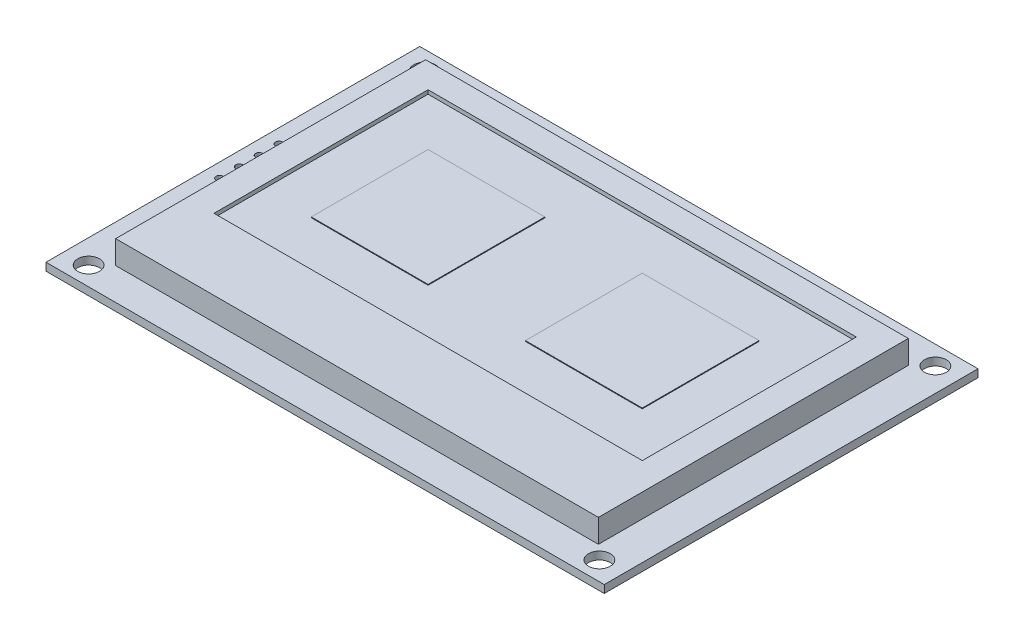
ISO-10303-21;
HEADER;
FILE_DESCRIPTION(('STEP AP214'),'2;1');
FILE_NAME('part.step','',(''),(''),'','','');
FILE_SCHEMA(('AUTOMOTIVE_DESIGN { 1 0 10303 214 1 1 1 1 }'));
ENDSEC;
DATA;
#1=APPLICATION_CONTEXT('core data for automotive mechanical design processes');
#2=APPLICATION_PROTOCOL_DEFINITION('international standard','automotive_design',2000,#1);
#3=PRODUCT_CONTEXT('',#1,'mechanical');
#4=PRODUCT('Part','Part','',(#3));
#5=PRODUCT_RELATED_PRODUCT_CATEGORY('part','',(#4));
#6=PRODUCT_DEFINITION_FORMATION('','',#4);
#7=PRODUCT_DEFINITION_CONTEXT('part definition',#1,'design');
#8=PRODUCT_DEFINITION('design','',#6,#7);
#9=PRODUCT_DEFINITION_SHAPE('','',#8);
#10=(LENGTH_UNIT() NAMED_UNIT(*) SI_UNIT(.MILLI.,.METRE.));
#11=(NAMED_UNIT(*) PLANE_ANGLE_UNIT() SI_UNIT($,.RADIAN.));
#12=(NAMED_UNIT(*) SI_UNIT($,.STERADIAN.) SOLID_ANGLE_UNIT());
#13=UNCERTAINTY_MEASURE_WITH_UNIT(LENGTH_MEASURE(1.E-05),#10,'distance_accuracy_value','');
#14=(GEOMETRIC_REPRESENTATION_CONTEXT(3) GLOBAL_UNCERTAINTY_ASSIGNED_CONTEXT((#13)) GLOBAL_UNIT_ASSIGNED_CONTEXT((#10,
#11,#12)) REPRESENTATION_CONTEXT('',''));
#15=CARTESIAN_POINT('',(0.,0.,0.));
#16=DIRECTION('',(0.,0.,1.));
#17=DIRECTION('',(1.,0.,0.));
#18=AXIS2_PLACEMENT_3D('',#15,#16,#17);
#19=CARTESIAN_POINT('',(0.,3.5,0.));
#20=DIRECTION('',(0.,1.,0.));
#21=DIRECTION('',(0.,0.,1.));
#22=AXIS2_PLACEMENT_3D('',#19,#20,#21);
#23=PLANE('',#22);
#24=DIRECTION('',(0.,0.,1.));
#25=VECTOR('',#24,1.);
#26=CARTESIAN_POINT('',(21.2525,3.5,4.52400000000001));
#27=LINE('',#26,#25);
#28=CARTESIAN_POINT('',(21.2525,3.5,-10.476));
#29=VERTEX_POINT('',#28);
#30=CARTESIAN_POINT('',(21.2525,3.5,4.52400000000001));
#31=VERTEX_POINT('',#30);
#32=EDGE_CURVE('E185',#29,#31,#27,.T.);
#33=ORIENTED_EDGE('',*,*,#32,.T.);
#34=DIRECTION('',(-1.,0.,0.));
#35=VECTOR('',#34,1.);
#36=CARTESIAN_POINT('',(6.2525,3.5,4.524));
#37=LINE('',#36,#35);
#38=CARTESIAN_POINT('',(6.2525,3.5,4.524));
#39=VERTEX_POINT('',#38);
#40=EDGE_CURVE('E199',#31,#39,#37,.T.);
#41=ORIENTED_EDGE('',*,*,#40,.T.);
#42=DIRECTION('',(0.,0.,-1.));
#43=VECTOR('',#42,1.);
#44=CARTESIAN_POINT('',(6.2525,3.5,4.524));
#45=LINE('',#44,#43);
#46=CARTESIAN_POINT('',(6.2525,3.5,-10.476));
#47=VERTEX_POINT('',#46);
#48=EDGE_CURVE('E63',#39,#47,#45,.T.);
#49=ORIENTED_EDGE('',*,*,#48,.T.);
#50=DIRECTION('',(1.,0.,0.));
#51=VECTOR('',#50,1.);
#52=CARTESIAN_POINT('',(6.2525,3.5,-10.476));
#53=LINE('',#52,#51);
#54=EDGE_CURVE('E58',#47,#29,#53,.T.);
#55=ORIENTED_EDGE('',*,*,#54,.T.);
#56=EDGE_LOOP('',(#33,#41,#49,#55));
#57=FACE_BOUND('',#56,.T.);
#58=DIRECTION('',(0.,0.,-1.));
#59=VECTOR('',#58,1.);
#60=CARTESIAN_POINT('',(27.505,3.5,-16.721));
#61=LINE('',#60,#59);
#62=CARTESIAN_POINT('',(27.505,3.5,10.769));
#63=VERTEX_POINT('',#62);
#64=CARTESIAN_POINT('',(27.505,3.5,-16.721));
#65=VERTEX_POINT('',#64);
#66=EDGE_CURVE('E294',#63,#65,#61,.T.);
#67=ORIENTED_EDGE('',*,*,#66,.T.);
#68=DIRECTION('',(-1.,0.,0.));
#69=VECTOR('',#68,1.);
#70=CARTESIAN_POINT('',(-27.505,3.5,-16.721));
#71=LINE('',#70,#69);
#72=CARTESIAN_POINT('',(-27.505,3.5,-16.721));
#73=VERTEX_POINT('',#72);
#74=EDGE_CURVE('E297',#65,#73,#71,.T.);
#75=ORIENTED_EDGE('',*,*,#74,.T.);
#76=DIRECTION('',(0.,0.,1.));
#77=VECTOR('',#76,1.);
#78=CARTESIAN_POINT('',(-27.505,3.5,-16.721));
#79=LINE('',#78,#77);
#80=CARTESIAN_POINT('',(-27.505,3.5,10.769));
#81=VERTEX_POINT('',#80);
#82=EDGE_CURVE('E301',#73,#81,#79,.T.);
#83=ORIENTED_EDGE('',*,*,#82,.T.);
#84=DIRECTION('',(1.,0.,0.));
#85=VECTOR('',#84,1.);
#86=CARTESIAN_POINT('',(-27.505,3.5,10.769));
#87=LINE('',#86,#85);
#88=EDGE_CURVE('E304',#81,#63,#87,.T.);
#89=ORIENTED_EDGE('',*,*,#88,.T.);
#90=EDGE_LOOP('',(#67,#75,#83,#89));
#91=FACE_BOUND('',#90,.T.);
#92=DIRECTION('',(1.,0.,0.));
#93=VECTOR('',#92,1.);
#94=CARTESIAN_POINT('',(-6.2525,3.5,4.524));
#95=LINE('',#94,#93);
#96=CARTESIAN_POINT('',(-21.2525,3.5,4.52400000000001));
#97=VERTEX_POINT('',#96);
#98=CARTESIAN_POINT('',(-6.2525,3.5,4.524));
#99=VERTEX_POINT('',#98);
#100=EDGE_CURVE('E230',#97,#99,#95,.T.);
#101=ORIENTED_EDGE('',*,*,#100,.F.);
#102=DIRECTION('',(0.,0.,1.));
#103=VECTOR('',#102,1.);
#104=CARTESIAN_POINT('',(-21.2525,3.5,4.52400000000001));
#105=LINE('',#104,#103);
#106=CARTESIAN_POINT('',(-21.2525,3.5,-10.476));
#107=VERTEX_POINT('',#106);
#108=EDGE_CURVE('E188',#107,#97,#105,.T.);
#109=ORIENTED_EDGE('',*,*,#108,.F.);
#110=DIRECTION('',(-1.,0.,0.));
#111=VECTOR('',#110,1.);
#112=CARTESIAN_POINT('',(-6.2525,3.5,-10.476));
#113=LINE('',#112,#111);
#114=CARTESIAN_POINT('',(-6.2525,3.5,-10.476));
#115=VERTEX_POINT('',#114);
#116=EDGE_CURVE('E221',#115,#107,#113,.T.);
#117=ORIENTED_EDGE('',*,*,#116,.F.);
#118=DIRECTION('',(0.,0.,-1.));
#119=VECTOR('',#118,1.);
#120=CARTESIAN_POINT('',(-6.2525,3.5,4.524));
#121=LINE('',#120,#119);
#122=EDGE_CURVE('E232',#99,#115,#121,.T.);
#123=ORIENTED_EDGE('',*,*,#122,.F.);
#124=EDGE_LOOP('',(#101,#109,#117,#123));
#125=FACE_BOUND('',#124,.T.);
#126=ADVANCED_FACE('F43',(#57,#91,#125),#23,.T.);
#127=CARTESIAN_POINT('',(35.85,1.,24.));
#128=DIRECTION('',(-1.,0.,0.));
#129=DIRECTION('',(0.,0.,1.));
#130=AXIS2_PLACEMENT_3D('',#127,#128,#129);
#131=PLANE('',#130);
#132=DIRECTION('',(0.,0.,-1.));
#133=VECTOR('',#132,1.);
#134=CARTESIAN_POINT('',(35.85,0.,24.));
#135=LINE('',#134,#133);
#136=CARTESIAN_POINT('',(35.85,0.,24.));
#137=VERTEX_POINT('',#136);
#138=CARTESIAN_POINT('',(35.85,0.,-24.));
#139=VERTEX_POINT('',#138);
#140=EDGE_CURVE('E382',#137,#139,#135,.T.);
#141=ORIENTED_EDGE('',*,*,#140,.T.);
#142=DIRECTION('',(0.,-1.,0.));
#143=VECTOR('',#142,1.);
#144=CARTESIAN_POINT('',(35.85,1.,-24.));
#145=LINE('',#144,#143);
#146=CARTESIAN_POINT('',(35.85,1.,-24.));
#147=VERTEX_POINT('',#146);
#148=EDGE_CURVE('E11',#147,#139,#145,.T.);
#149=ORIENTED_EDGE('',*,*,#148,.F.);
#150=DIRECTION('',(0.,0.,-1.));
#151=VECTOR('',#150,1.);
#152=CARTESIAN_POINT('',(35.85,1.,24.));
#153=LINE('',#152,#151);
#154=CARTESIAN_POINT('',(35.85,1.,24.));
#155=VERTEX_POINT('',#154);
#156=EDGE_CURVE('E385',#155,#147,#153,.T.);
#157=ORIENTED_EDGE('',*,*,#156,.F.);
#158=DIRECTION('',(0.,-1.,0.));
#159=VECTOR('',#158,1.);
#160=CARTESIAN_POINT('',(35.85,1.,24.));
#161=LINE('',#160,#159);
#162=EDGE_CURVE('E395',#155,#137,#161,.T.);
#163=ORIENTED_EDGE('',*,*,#162,.T.);
#164=EDGE_LOOP('',(#141,#149,#157,#163));
#165=FACE_BOUND('',#164,.T.);
#166=ADVANCED_FACE('F45',(#165),#131,.F.);
#167=CARTESIAN_POINT('',(-35.85,1.,-24.));
#168=DIRECTION('',(0.,0.,1.));
#169=DIRECTION('',(1.,0.,0.));
#170=AXIS2_PLACEMENT_3D('',#167,#168,#169);
#171=PLANE('',#170);
#172=DIRECTION('',(-1.,0.,0.));
#173=VECTOR('',#172,1.);
#174=CARTESIAN_POINT('',(-35.85,0.,-24.));
#175=LINE('',#174,#173);
#176=CARTESIAN_POINT('',(-35.85,0.,-24.));
#177=VERTEX_POINT('',#176);
#178=EDGE_CURVE('E398',#139,#177,#175,.T.);
#179=ORIENTED_EDGE('',*,*,#178,.T.);
#180=DIRECTION('',(0.,-1.,0.));
#181=VECTOR('',#180,1.);
#182=CARTESIAN_POINT('',(-35.85,1.,-24.));
#183=LINE('',#182,#181);
#184=CARTESIAN_POINT('',(-35.85,1.,-24.));
#185=VERTEX_POINT('',#184);
#186=EDGE_CURVE('E51',#185,#177,#183,.T.);
#187=ORIENTED_EDGE('',*,*,#186,.F.);
#188=DIRECTION('',(-1.,0.,0.));
#189=VECTOR('',#188,1.);
#190=CARTESIAN_POINT('',(-35.85,1.,-24.));
#191=LINE('',#190,#189);
#192=EDGE_CURVE('E388',#147,#185,#191,.T.);
#193=ORIENTED_EDGE('',*,*,#192,.F.);
#194=ORIENTED_EDGE('',*,*,#148,.T.);
#195=EDGE_LOOP('',(#179,#187,#193,#194));
#196=FACE_BOUND('',#195,.T.);
#197=ADVANCED_FACE('F428',(#196),#171,.F.);
#198=CARTESIAN_POINT('',(-35.85,1.,24.));
#199=DIRECTION('',(1.,0.,0.));
#200=DIRECTION('',(0.,0.,-1.));
#201=AXIS2_PLACEMENT_3D('',#198,#199,#200);
#202=PLANE('',#201);
#203=DIRECTION('',(0.,0.,1.));
#204=VECTOR('',#203,1.);
#205=CARTESIAN_POINT('',(-35.85,0.,24.));
#206=LINE('',#205,#204);
#207=CARTESIAN_POINT('',(-35.85,0.,24.));
#208=VERTEX_POINT('',#207);
#209=EDGE_CURVE('E400',#177,#208,#206,.T.);
#210=ORIENTED_EDGE('',*,*,#209,.T.);
#211=DIRECTION('',(0.,-1.,0.));
#212=VECTOR('',#211,1.);
#213=CARTESIAN_POINT('',(-35.85,1.,24.));
#214=LINE('',#213,#212);
#215=CARTESIAN_POINT('',(-35.85,1.,24.));
#216=VERTEX_POINT('',#215);
#217=EDGE_CURVE('E405',#216,#208,#214,.T.);
#218=ORIENTED_EDGE('',*,*,#217,.F.);
#219=DIRECTION('',(0.,0.,1.));
#220=VECTOR('',#219,1.);
#221=CARTESIAN_POINT('',(-35.85,1.,24.));
#222=LINE('',#221,#220);
#223=EDGE_CURVE('E391',#185,#216,#222,.T.);
#224=ORIENTED_EDGE('',*,*,#223,.F.);
#225=ORIENTED_EDGE('',*,*,#186,.T.);
#226=EDGE_LOOP('',(#210,#218,#224,#225));
#227=FACE_BOUND('',#226,.T.);
#228=ADVANCED_FACE('F412',(#227),#202,.F.);
#229=CARTESIAN_POINT('',(-35.85,1.,24.));
#230=DIRECTION('',(0.,0.,-1.));
#231=DIRECTION('',(-1.,0.,0.));
#232=AXIS2_PLACEMENT_3D('',#229,#230,#231);
#233=PLANE('',#232);
#234=DIRECTION('',(1.,0.,0.));
#235=VECTOR('',#234,1.);
#236=CARTESIAN_POINT('',(-35.85,0.,24.));
#237=LINE('',#236,#235);
#238=EDGE_CURVE('E389',#208,#137,#237,.T.);
#239=ORIENTED_EDGE('',*,*,#238,.T.);
#240=ORIENTED_EDGE('',*,*,#162,.F.);
#241=DIRECTION('',(1.,0.,0.));
#242=VECTOR('',#241,1.);
#243=CARTESIAN_POINT('',(-35.85,1.,24.));
#244=LINE('',#243,#242);
#245=EDGE_CURVE('E393',#216,#155,#244,.T.);
#246=ORIENTED_EDGE('',*,*,#245,.F.);
#247=ORIENTED_EDGE('',*,*,#217,.T.);
#248=EDGE_LOOP('',(#239,#240,#246,#247));
#249=FACE_BOUND('',#248,.T.);
#250=ADVANCED_FACE('F421',(#249),#233,.F.);
#251=CARTESIAN_POINT('',(0.,1.,0.));
#252=DIRECTION('',(0.,-1.,0.));
#253=DIRECTION('',(0.,0.,-1.));
#254=AXIS2_PLACEMENT_3D('',#251,#252,#253);
#255=PLANE('',#254);
#256=CARTESIAN_POINT('',(-34.05,1.,3.51));
#257=DIRECTION('',(0.,1.,0.));
#258=DIRECTION('',(0.,0.,1.));
#259=AXIS2_PLACEMENT_3D('',#256,#257,#258);
#260=CIRCLE('',#259,0.450000000000002);
#261=CARTESIAN_POINT('',(-34.05,1.,3.96));
#262=VERTEX_POINT('',#261);
#263=EDGE_CURVE('E248',#262,#262,#260,.T.);
#264=ORIENTED_EDGE('',*,*,#263,.F.);
#265=EDGE_LOOP('',(#264));
#266=FACE_BOUND('',#265,.T.);
#267=CARTESIAN_POINT('',(-34.05,1.,0.970000000000001));
#268=DIRECTION('',(0.,1.,0.));
#269=DIRECTION('',(0.,0.,1.));
#270=AXIS2_PLACEMENT_3D('',#267,#268,#269);
#271=CIRCLE('',#270,0.450000000000002);
#272=CARTESIAN_POINT('',(-34.05,1.,1.42));
#273=VERTEX_POINT('',#272);
#274=EDGE_CURVE('E254',#273,#273,#271,.T.);
#275=ORIENTED_EDGE('',*,*,#274,.F.);
#276=EDGE_LOOP('',(#275));
#277=FACE_BOUND('',#276,.T.);
#278=CARTESIAN_POINT('',(-34.05,1.,-1.57));
#279=DIRECTION('',(0.,1.,0.));
#280=DIRECTION('',(0.,0.,1.));
#281=AXIS2_PLACEMENT_3D('',#278,#279,#280);
#282=CIRCLE('',#281,0.450000000000002);
#283=CARTESIAN_POINT('',(-34.05,1.,-1.12));
#284=VERTEX_POINT('',#283);
#285=EDGE_CURVE('E260',#284,#284,#282,.T.);
#286=ORIENTED_EDGE('',*,*,#285,.F.);
#287=EDGE_LOOP('',(#286));
#288=FACE_BOUND('',#287,.T.);
#289=CARTESIAN_POINT('',(-34.05,1.,-4.11));
#290=DIRECTION('',(0.,1.,0.));
#291=DIRECTION('',(0.,0.,1.));
#292=AXIS2_PLACEMENT_3D('',#289,#290,#291);
#293=CIRCLE('',#292,0.450000000000002);
#294=CARTESIAN_POINT('',(-34.05,1.,-3.66));
#295=VERTEX_POINT('',#294);
#296=EDGE_CURVE('E263',#295,#295,#293,.T.);
#297=ORIENTED_EDGE('',*,*,#296,.F.);
#298=EDGE_LOOP('',(#297));
#299=FACE_BOUND('',#298,.T.);
#300=CARTESIAN_POINT('',(2.95999999999999,1.,-21.55));
#301=DIRECTION('',(0.,1.,0.));
#302=DIRECTION('',(0.,0.,1.));
#303=AXIS2_PLACEMENT_3D('',#300,#301,#302);
#304=CIRCLE('',#303,0.449999999999999);
#305=CARTESIAN_POINT('',(2.95999999999999,1.,-21.1));
#306=VERTEX_POINT('',#305);
#307=EDGE_CURVE('E272',#306,#306,#304,.T.);
#308=ORIENTED_EDGE('',*,*,#307,.F.);
#309=EDGE_LOOP('',(#308));
#310=FACE_BOUND('',#309,.T.);
#311=CARTESIAN_POINT('',(0.419999999999989,1.,-21.55));
#312=DIRECTION('',(0.,1.,0.));
#313=DIRECTION('',(0.,0.,1.));
#314=AXIS2_PLACEMENT_3D('',#311,#312,#313);
#315=CIRCLE('',#314,0.449999999999999);
#316=CARTESIAN_POINT('',(0.419999999999989,1.,-21.1));
#317=VERTEX_POINT('',#316);
#318=EDGE_CURVE('E278',#317,#317,#315,.T.);
#319=ORIENTED_EDGE('',*,*,#318,.F.);
#320=EDGE_LOOP('',(#319));
#321=FACE_BOUND('',#320,.T.);
#322=CARTESIAN_POINT('',(-2.12000000000001,1.,-21.55));
#323=DIRECTION('',(0.,1.,0.));
#324=DIRECTION('',(0.,0.,1.));
#325=AXIS2_PLACEMENT_3D('',#322,#323,#324);
#326=CIRCLE('',#325,0.449999999999999);
#327=CARTESIAN_POINT('',(-2.12000000000001,1.,-21.1));
#328=VERTEX_POINT('',#327);
#329=EDGE_CURVE('E284',#328,#328,#326,.T.);
#330=ORIENTED_EDGE('',*,*,#329,.F.);
#331=EDGE_LOOP('',(#330));
#332=FACE_BOUND('',#331,.T.);
#333=CARTESIAN_POINT('',(-4.66000000000001,1.,-21.55));
#334=DIRECTION('',(0.,1.,0.));
#335=DIRECTION('',(0.,0.,1.));
#336=AXIS2_PLACEMENT_3D('',#333,#334,#335);
#337=CIRCLE('',#336,0.449999999999999);
#338=CARTESIAN_POINT('',(-4.66000000000001,1.,-21.1));
#339=VERTEX_POINT('',#338);
#340=EDGE_CURVE('E287',#339,#339,#337,.T.);
#341=ORIENTED_EDGE('',*,*,#340,.F.);
#342=EDGE_LOOP('',(#341));
#343=FACE_BOUND('',#342,.T.);
#344=DIRECTION('',(0.,0.,-1.));
#345=VECTOR('',#344,1.);
#346=CARTESIAN_POINT('',(-31.,1.,0.));
#347=LINE('',#346,#345);
#348=CARTESIAN_POINT('',(-31.,1.,19.9));
#349=VERTEX_POINT('',#348);
#350=CARTESIAN_POINT('',(-31.,1.,-19.9));
#351=VERTEX_POINT('',#350);
#352=EDGE_CURVE('E354',#349,#351,#347,.T.);
#353=ORIENTED_EDGE('',*,*,#352,.T.);
#354=DIRECTION('',(1.,0.,0.));
#355=VECTOR('',#354,1.);
#356=CARTESIAN_POINT('',(0.,1.,-19.9));
#357=LINE('',#356,#355);
#358=CARTESIAN_POINT('',(31.,1.,-19.9));
#359=VERTEX_POINT('',#358);
#360=EDGE_CURVE('E357',#351,#359,#357,.T.);
#361=ORIENTED_EDGE('',*,*,#360,.T.);
#362=DIRECTION('',(0.,0.,1.));
#363=VECTOR('',#362,1.);
#364=CARTESIAN_POINT('',(31.,1.,0.));
#365=LINE('',#364,#363);
#366=CARTESIAN_POINT('',(31.,1.,19.9));
#367=VERTEX_POINT('',#366);
#368=EDGE_CURVE('E341',#359,#367,#365,.T.);
#369=ORIENTED_EDGE('',*,*,#368,.T.);
#370=DIRECTION('',(-1.,0.,0.));
#371=VECTOR('',#370,1.);
#372=CARTESIAN_POINT('',(0.,1.,19.9));
#373=LINE('',#372,#371);
#374=EDGE_CURVE('E351',#367,#349,#373,.T.);
#375=ORIENTED_EDGE('',*,*,#374,.T.);
#376=EDGE_LOOP('',(#353,#361,#369,#375));
#377=FACE_BOUND('',#376,.T.);
#378=CARTESIAN_POINT('',(32.8,1.,-21.575));
#379=DIRECTION('',(0.,1.,0.));
#380=DIRECTION('',(0.,0.,1.));
#381=AXIS2_PLACEMENT_3D('',#378,#379,#380);
#382=CIRCLE('',#381,1.4);
#383=CARTESIAN_POINT('',(32.8,1.,-20.175));
#384=VERTEX_POINT('',#383);
#385=EDGE_CURVE('E367',#384,#384,#382,.T.);
#386=ORIENTED_EDGE('',*,*,#385,.F.);
#387=EDGE_LOOP('',(#386));
#388=FACE_BOUND('',#387,.T.);
#389=CARTESIAN_POINT('',(-32.8,1.,21.575));
#390=DIRECTION('',(0.,1.,0.));
#391=DIRECTION('',(0.,0.,1.));
#392=AXIS2_PLACEMENT_3D('',#389,#390,#391);
#393=CIRCLE('',#392,1.4);
#394=CARTESIAN_POINT('',(-32.8,1.,22.975));
#395=VERTEX_POINT('',#394);
#396=EDGE_CURVE('E374',#395,#395,#393,.T.);
#397=ORIENTED_EDGE('',*,*,#396,.F.);
#398=EDGE_LOOP('',(#397));
#399=FACE_BOUND('',#398,.T.);
#400=CARTESIAN_POINT('',(32.8,1.,21.575));
#401=DIRECTION('',(0.,1.,0.));
#402=DIRECTION('',(0.,0.,1.));
#403=AXIS2_PLACEMENT_3D('',#400,#401,#402);
#404=CIRCLE('',#403,1.4);
#405=CARTESIAN_POINT('',(32.8,1.,22.975));
#406=VERTEX_POINT('',#405);
#407=EDGE_CURVE('E361',#406,#406,#404,.T.);
#408=ORIENTED_EDGE('',*,*,#407,.F.);
#409=EDGE_LOOP('',(#408));
#410=FACE_BOUND('',#409,.T.);
#411=CARTESIAN_POINT('',(-32.8,1.,-21.575));
#412=DIRECTION('',(0.,1.,0.));
#413=DIRECTION('',(0.,0.,1.));
#414=AXIS2_PLACEMENT_3D('',#411,#412,#413);
#415=CIRCLE('',#414,1.4);
#416=CARTESIAN_POINT('',(-32.8,1.,-20.175));
#417=VERTEX_POINT('',#416);
#418=EDGE_CURVE('E370',#417,#417,#415,.T.);
#419=ORIENTED_EDGE('',*,*,#418,.F.);
#420=EDGE_LOOP('',(#419));
#421=FACE_BOUND('',#420,.T.);
#422=ORIENTED_EDGE('',*,*,#156,.T.);
#423=ORIENTED_EDGE('',*,*,#192,.T.);
#424=ORIENTED_EDGE('',*,*,#223,.T.);
#425=ORIENTED_EDGE('',*,*,#245,.T.);
#426=EDGE_LOOP('',(#422,#423,#424,#425));
#427=FACE_BOUND('',#426,.T.);
#428=ADVANCED_FACE('F427',(#266,#277,#288,#299,#310,#321,#332,#343,#377,#388,#399,#410,#421,
#427),#255,.F.);
#429=CARTESIAN_POINT('',(0.,0.,0.));
#430=DIRECTION('',(0.,-1.,0.));
#431=DIRECTION('',(0.,0.,-1.));
#432=AXIS2_PLACEMENT_3D('',#429,#430,#431);
#433=PLANE('',#432);
#434=CARTESIAN_POINT('',(-34.05,0.,3.51));
#435=DIRECTION('',(0.,1.,0.));
#436=DIRECTION('',(0.,0.,1.));
#437=AXIS2_PLACEMENT_3D('',#434,#435,#436);
#438=CIRCLE('',#437,0.450000000000002);
#439=CARTESIAN_POINT('',(-34.05,0.,3.96));
#440=VERTEX_POINT('',#439);
#441=EDGE_CURVE('E245',#440,#440,#438,.T.);
#442=ORIENTED_EDGE('',*,*,#441,.T.);
#443=EDGE_LOOP('',(#442));
#444=FACE_BOUND('',#443,.T.);
#445=CARTESIAN_POINT('',(-34.05,0.,0.970000000000001));
#446=DIRECTION('',(0.,1.,0.));
#447=DIRECTION('',(0.,0.,1.));
#448=AXIS2_PLACEMENT_3D('',#445,#446,#447);
#449=CIRCLE('',#448,0.450000000000002);
#450=CARTESIAN_POINT('',(-34.05,0.,1.42));
#451=VERTEX_POINT('',#450);
#452=EDGE_CURVE('E251',#451,#451,#449,.T.);
#453=ORIENTED_EDGE('',*,*,#452,.T.);
#454=EDGE_LOOP('',(#453));
#455=FACE_BOUND('',#454,.T.);
#456=CARTESIAN_POINT('',(-34.05,0.,-1.57));
#457=DIRECTION('',(0.,1.,0.));
#458=DIRECTION('',(0.,0.,1.));
#459=AXIS2_PLACEMENT_3D('',#456,#457,#458);
#460=CIRCLE('',#459,0.450000000000002);
#461=CARTESIAN_POINT('',(-34.05,0.,-1.12));
#462=VERTEX_POINT('',#461);
#463=EDGE_CURVE('E257',#462,#462,#460,.T.);
#464=ORIENTED_EDGE('',*,*,#463,.T.);
#465=EDGE_LOOP('',(#464));
#466=FACE_BOUND('',#465,.T.);
#467=CARTESIAN_POINT('',(-34.05,0.,-4.11));
#468=DIRECTION('',(0.,1.,0.));
#469=DIRECTION('',(0.,0.,1.));
#470=AXIS2_PLACEMENT_3D('',#467,#468,#469);
#471=CIRCLE('',#470,0.450000000000002);
#472=CARTESIAN_POINT('',(-34.05,0.,-3.66));
#473=VERTEX_POINT('',#472);
#474=EDGE_CURVE('E264',#473,#473,#471,.T.);
#475=ORIENTED_EDGE('',*,*,#474,.T.);
#476=EDGE_LOOP('',(#475));
#477=FACE_BOUND('',#476,.T.);
#478=CARTESIAN_POINT('',(2.95999999999999,0.,-21.55));
#479=DIRECTION('',(0.,1.,0.));
#480=DIRECTION('',(0.,0.,1.));
#481=AXIS2_PLACEMENT_3D('',#478,#479,#480);
#482=CIRCLE('',#481,0.449999999999999);
#483=CARTESIAN_POINT('',(2.95999999999999,0.,-21.1));
#484=VERTEX_POINT('',#483);
#485=EDGE_CURVE('E267',#484,#484,#482,.T.);
#486=ORIENTED_EDGE('',*,*,#485,.T.);
#487=EDGE_LOOP('',(#486));
#488=FACE_BOUND('',#487,.T.);
#489=CARTESIAN_POINT('',(0.419999999999989,0.,-21.55));
#490=DIRECTION('',(0.,1.,0.));
#491=DIRECTION('',(0.,0.,1.));
#492=AXIS2_PLACEMENT_3D('',#489,#490,#491);
#493=CIRCLE('',#492,0.449999999999999);
#494=CARTESIAN_POINT('',(0.419999999999989,0.,-21.1));
#495=VERTEX_POINT('',#494);
#496=EDGE_CURVE('E275',#495,#495,#493,.T.);
#497=ORIENTED_EDGE('',*,*,#496,.T.);
#498=EDGE_LOOP('',(#497));
#499=FACE_BOUND('',#498,.T.);
#500=CARTESIAN_POINT('',(-2.12000000000001,0.,-21.55));
#501=DIRECTION('',(0.,1.,0.));
#502=DIRECTION('',(0.,0.,1.));
#503=AXIS2_PLACEMENT_3D('',#500,#501,#502);
#504=CIRCLE('',#503,0.449999999999999);
#505=CARTESIAN_POINT('',(-2.12000000000001,0.,-21.1));
#506=VERTEX_POINT('',#505);
#507=EDGE_CURVE('E281',#506,#506,#504,.T.);
#508=ORIENTED_EDGE('',*,*,#507,.T.);
#509=EDGE_LOOP('',(#508));
#510=FACE_BOUND('',#509,.T.);
#511=CARTESIAN_POINT('',(-4.66000000000001,0.,-21.55));
#512=DIRECTION('',(0.,1.,0.));
#513=DIRECTION('',(0.,0.,1.));
#514=AXIS2_PLACEMENT_3D('',#511,#512,#513);
#515=CIRCLE('',#514,0.449999999999999);
#516=CARTESIAN_POINT('',(-4.66000000000001,0.,-21.1));
#517=VERTEX_POINT('',#516);
#518=EDGE_CURVE('E288',#517,#517,#515,.T.);
#519=ORIENTED_EDGE('',*,*,#518,.T.);
#520=EDGE_LOOP('',(#519));
#521=FACE_BOUND('',#520,.T.);
#522=CARTESIAN_POINT('',(32.8,0.,-21.575));
#523=DIRECTION('',(0.,1.,0.));
#524=DIRECTION('',(0.,0.,1.));
#525=AXIS2_PLACEMENT_3D('',#522,#523,#524);
#526=CIRCLE('',#525,1.4);
#527=CARTESIAN_POINT('',(32.8,0.,-20.175));
#528=VERTEX_POINT('',#527);
#529=EDGE_CURVE('E371',#528,#528,#526,.T.);
#530=ORIENTED_EDGE('',*,*,#529,.T.);
#531=EDGE_LOOP('',(#530));
#532=FACE_BOUND('',#531,.T.);
#533=CARTESIAN_POINT('',(-32.8,0.,21.575));
#534=DIRECTION('',(0.,1.,0.));
#535=DIRECTION('',(0.,0.,1.));
#536=AXIS2_PLACEMENT_3D('',#533,#534,#535);
#537=CIRCLE('',#536,1.4);
#538=CARTESIAN_POINT('',(-32.8,0.,22.975));
#539=VERTEX_POINT('',#538);
#540=EDGE_CURVE('E364',#539,#539,#537,.T.);
#541=ORIENTED_EDGE('',*,*,#540,.T.);
#542=EDGE_LOOP('',(#541));
#543=FACE_BOUND('',#542,.T.);
#544=CARTESIAN_POINT('',(32.8,0.,21.575));
#545=DIRECTION('',(0.,1.,0.));
#546=DIRECTION('',(0.,0.,1.));
#547=AXIS2_PLACEMENT_3D('',#544,#545,#546);
#548=CIRCLE('',#547,1.4);
#549=CARTESIAN_POINT('',(32.8,0.,22.975));
#550=VERTEX_POINT('',#549);
#551=EDGE_CURVE('E360',#550,#550,#548,.T.);
#552=ORIENTED_EDGE('',*,*,#551,.T.);
#553=EDGE_LOOP('',(#552));
#554=FACE_BOUND('',#553,.T.);
#555=CARTESIAN_POINT('',(-32.8,0.,-21.575));
#556=DIRECTION('',(0.,1.,0.));
#557=DIRECTION('',(0.,0.,1.));
#558=AXIS2_PLACEMENT_3D('',#555,#556,#557);
#559=CIRCLE('',#558,1.4);
#560=CARTESIAN_POINT('',(-32.8,0.,-20.175));
#561=VERTEX_POINT('',#560);
#562=EDGE_CURVE('E379',#561,#561,#559,.T.);
#563=ORIENTED_EDGE('',*,*,#562,.T.);
#564=EDGE_LOOP('',(#563));
#565=FACE_BOUND('',#564,.T.);
#566=ORIENTED_EDGE('',*,*,#140,.F.);
#567=ORIENTED_EDGE('',*,*,#238,.F.);
#568=ORIENTED_EDGE('',*,*,#209,.F.);
#569=ORIENTED_EDGE('',*,*,#178,.F.);
#570=EDGE_LOOP('',(#566,#567,#568,#569));
#571=FACE_BOUND('',#570,.T.);
#572=ADVANCED_FACE('F418',(#444,#455,#466,#477,#488,#499,#510,#521,#532,#543,#554,#565,#571),
#433,.T.);
#573=CARTESIAN_POINT('',(-32.8,0.,-21.575));
#574=DIRECTION('',(0.,1.,0.));
#575=DIRECTION('',(0.,0.,1.));
#576=AXIS2_PLACEMENT_3D('',#573,#574,#575);
#577=CYLINDRICAL_SURFACE('',#576,1.4);
#578=ORIENTED_EDGE('',*,*,#562,.F.);
#579=EDGE_LOOP('',(#578));
#580=FACE_BOUND('',#579,.T.);
#581=ORIENTED_EDGE('',*,*,#418,.T.);
#582=EDGE_LOOP('',(#581));
#583=FACE_BOUND('',#582,.T.);
#584=ADVANCED_FACE('F487',(#580,#583),#577,.F.);
#585=CARTESIAN_POINT('',(32.8,0.,21.575));
#586=DIRECTION('',(0.,1.,0.));
#587=DIRECTION('',(0.,0.,1.));
#588=AXIS2_PLACEMENT_3D('',#585,#586,#587);
#589=CYLINDRICAL_SURFACE('',#588,1.4);
#590=ORIENTED_EDGE('',*,*,#551,.F.);
#591=EDGE_LOOP('',(#590));
#592=FACE_BOUND('',#591,.T.);
#593=ORIENTED_EDGE('',*,*,#407,.T.);
#594=EDGE_LOOP('',(#593));
#595=FACE_BOUND('',#594,.T.);
#596=ADVANCED_FACE('F483',(#592,#595),#589,.F.);
#597=CARTESIAN_POINT('',(-32.8,0.,21.575));
#598=DIRECTION('',(0.,1.,0.));
#599=DIRECTION('',(0.,0.,1.));
#600=AXIS2_PLACEMENT_3D('',#597,#598,#599);
#601=CYLINDRICAL_SURFACE('',#600,1.4);
#602=ORIENTED_EDGE('',*,*,#540,.F.);
#603=EDGE_LOOP('',(#602));
#604=FACE_BOUND('',#603,.T.);
#605=ORIENTED_EDGE('',*,*,#396,.T.);
#606=EDGE_LOOP('',(#605));
#607=FACE_BOUND('',#606,.T.);
#608=ADVANCED_FACE('F486',(#604,#607),#601,.F.);
#609=CARTESIAN_POINT('',(32.8,0.,-21.575));
#610=DIRECTION('',(0.,1.,0.));
#611=DIRECTION('',(0.,0.,1.));
#612=AXIS2_PLACEMENT_3D('',#609,#610,#611);
#613=CYLINDRICAL_SURFACE('',#612,1.4);
#614=ORIENTED_EDGE('',*,*,#529,.F.);
#615=EDGE_LOOP('',(#614));
#616=FACE_BOUND('',#615,.T.);
#617=ORIENTED_EDGE('',*,*,#385,.T.);
#618=EDGE_LOOP('',(#617));
#619=FACE_BOUND('',#618,.T.);
#620=ADVANCED_FACE('F481',(#616,#619),#613,.F.);
#621=CARTESIAN_POINT('',(0.,4.,-19.9));
#622=DIRECTION('',(0.,0.,-1.));
#623=DIRECTION('',(-1.,0.,0.));
#624=AXIS2_PLACEMENT_3D('',#621,#622,#623);
#625=PLANE('',#624);
#626=ORIENTED_EDGE('',*,*,#360,.F.);
#627=DIRECTION('',(0.,-1.,0.));
#628=VECTOR('',#627,1.);
#629=CARTESIAN_POINT('',(-31.,4.,-19.9));
#630=LINE('',#629,#628);
#631=CARTESIAN_POINT('',(-31.,4.,-19.9));
#632=VERTEX_POINT('',#631);
#633=EDGE_CURVE('E338',#632,#351,#630,.T.);
#634=ORIENTED_EDGE('',*,*,#633,.F.);
#635=DIRECTION('',(1.,0.,0.));
#636=VECTOR('',#635,1.);
#637=CARTESIAN_POINT('',(0.,4.,-19.9));
#638=LINE('',#637,#636);
#639=CARTESIAN_POINT('',(31.,4.,-19.9));
#640=VERTEX_POINT('',#639);
#641=EDGE_CURVE('E319',#632,#640,#638,.T.);
#642=ORIENTED_EDGE('',*,*,#641,.T.);
#643=DIRECTION('',(0.,-1.,0.));
#644=VECTOR('',#643,1.);
#645=CARTESIAN_POINT('',(31.,4.,-19.9));
#646=LINE('',#645,#644);
#647=EDGE_CURVE('E337',#640,#359,#646,.T.);
#648=ORIENTED_EDGE('',*,*,#647,.T.);
#649=EDGE_LOOP('',(#626,#634,#642,#648));
#650=FACE_BOUND('',#649,.T.);
#651=ADVANCED_FACE('F471',(#650),#625,.T.);
#652=CARTESIAN_POINT('',(-31.,4.,0.));
#653=DIRECTION('',(-1.,0.,0.));
#654=DIRECTION('',(0.,0.,1.));
#655=AXIS2_PLACEMENT_3D('',#652,#653,#654);
#656=PLANE('',#655);
#657=ORIENTED_EDGE('',*,*,#352,.F.);
#658=DIRECTION('',(0.,-1.,0.));
#659=VECTOR('',#658,1.);
#660=CARTESIAN_POINT('',(-31.,4.,19.9));
#661=LINE('',#660,#659);
#662=CARTESIAN_POINT('',(-31.,4.,19.9));
#663=VERTEX_POINT('',#662);
#664=EDGE_CURVE('E342',#663,#349,#661,.T.);
#665=ORIENTED_EDGE('',*,*,#664,.F.);
#666=DIRECTION('',(0.,0.,-1.));
#667=VECTOR('',#666,1.);
#668=CARTESIAN_POINT('',(-31.,4.,0.));
#669=LINE('',#668,#667);
#670=EDGE_CURVE('E334',#663,#632,#669,.T.);
#671=ORIENTED_EDGE('',*,*,#670,.T.);
#672=ORIENTED_EDGE('',*,*,#633,.T.);
#673=EDGE_LOOP('',(#657,#665,#671,#672));
#674=FACE_BOUND('',#673,.T.);
#675=ADVANCED_FACE('F467',(#674),#656,.T.);
#676=CARTESIAN_POINT('',(0.,4.,19.9));
#677=DIRECTION('',(0.,0.,1.));
#678=DIRECTION('',(1.,0.,0.));
#679=AXIS2_PLACEMENT_3D('',#676,#677,#678);
#680=PLANE('',#679);
#681=ORIENTED_EDGE('',*,*,#374,.F.);
#682=DIRECTION('',(0.,-1.,0.));
#683=VECTOR('',#682,1.);
#684=CARTESIAN_POINT('',(31.,4.,19.9));
#685=LINE('',#684,#683);
#686=CARTESIAN_POINT('',(31.,4.,19.9));
#687=VERTEX_POINT('',#686);
#688=EDGE_CURVE('E345',#687,#367,#685,.T.);
#689=ORIENTED_EDGE('',*,*,#688,.F.);
#690=DIRECTION('',(-1.,0.,0.));
#691=VECTOR('',#690,1.);
#692=CARTESIAN_POINT('',(0.,4.,19.9));
#693=LINE('',#692,#691);
#694=EDGE_CURVE('E331',#687,#663,#693,.T.);
#695=ORIENTED_EDGE('',*,*,#694,.T.);
#696=ORIENTED_EDGE('',*,*,#664,.T.);
#697=EDGE_LOOP('',(#681,#689,#695,#696));
#698=FACE_BOUND('',#697,.T.);
#699=ADVANCED_FACE('F470',(#698),#680,.T.);
#700=CARTESIAN_POINT('',(31.,4.,0.));
#701=DIRECTION('',(1.,0.,0.));
#702=DIRECTION('',(0.,0.,-1.));
#703=AXIS2_PLACEMENT_3D('',#700,#701,#702);
#704=PLANE('',#703);
#705=ORIENTED_EDGE('',*,*,#368,.F.);
#706=ORIENTED_EDGE('',*,*,#647,.F.);
#707=DIRECTION('',(0.,0.,1.));
#708=VECTOR('',#707,1.);
#709=CARTESIAN_POINT('',(31.,4.,0.));
#710=LINE('',#709,#708);
#711=EDGE_CURVE('E328',#640,#687,#710,.T.);
#712=ORIENTED_EDGE('',*,*,#711,.T.);
#713=ORIENTED_EDGE('',*,*,#688,.T.);
#714=EDGE_LOOP('',(#705,#706,#712,#713));
#715=FACE_BOUND('',#714,.T.);
#716=ADVANCED_FACE('F465',(#715),#704,.T.);
#717=CARTESIAN_POINT('',(0.,4.,0.));
#718=DIRECTION('',(0.,-1.,0.));
#719=DIRECTION('',(0.,0.,-1.));
#720=AXIS2_PLACEMENT_3D('',#717,#718,#719);
#721=PLANE('',#720);
#722=DIRECTION('',(-1.,0.,0.));
#723=VECTOR('',#722,1.);
#724=CARTESIAN_POINT('',(-27.505,4.,-16.721));
#725=LINE('',#724,#723);
#726=CARTESIAN_POINT('',(27.505,4.,-16.721));
#727=VERTEX_POINT('',#726);
#728=CARTESIAN_POINT('',(-27.505,4.,-16.721));
#729=VERTEX_POINT('',#728);
#730=EDGE_CURVE('E309',#727,#729,#725,.T.);
#731=ORIENTED_EDGE('',*,*,#730,.F.);
#732=DIRECTION('',(0.,0.,-1.));
#733=VECTOR('',#732,1.);
#734=CARTESIAN_POINT('',(27.505,4.,-16.721));
#735=LINE('',#734,#733);
#736=CARTESIAN_POINT('',(27.505,4.,10.769));
#737=VERTEX_POINT('',#736);
#738=EDGE_CURVE('E291',#737,#727,#735,.T.);
#739=ORIENTED_EDGE('',*,*,#738,.F.);
#740=DIRECTION('',(1.,0.,0.));
#741=VECTOR('',#740,1.);
#742=CARTESIAN_POINT('',(-27.505,4.,10.769));
#743=LINE('',#742,#741);
#744=CARTESIAN_POINT('',(-27.505,4.,10.769));
#745=VERTEX_POINT('',#744);
#746=EDGE_CURVE('E298',#745,#737,#743,.T.);
#747=ORIENTED_EDGE('',*,*,#746,.F.);
#748=DIRECTION('',(0.,0.,1.));
#749=VECTOR('',#748,1.);
#750=CARTESIAN_POINT('',(-27.505,4.,-16.721));
#751=LINE('',#750,#749);
#752=EDGE_CURVE('E312',#729,#745,#751,.T.);
#753=ORIENTED_EDGE('',*,*,#752,.F.);
#754=EDGE_LOOP('',(#731,#739,#747,#753));
#755=FACE_BOUND('',#754,.T.);
#756=ORIENTED_EDGE('',*,*,#641,.F.);
#757=ORIENTED_EDGE('',*,*,#670,.F.);
#758=ORIENTED_EDGE('',*,*,#694,.F.);
#759=ORIENTED_EDGE('',*,*,#711,.F.);
#760=EDGE_LOOP('',(#756,#757,#758,#759));
#761=FACE_BOUND('',#760,.T.);
#762=ADVANCED_FACE('F461',(#755,#761),#721,.F.);
#763=CARTESIAN_POINT('',(27.505,3.5,-16.721));
#764=DIRECTION('',(1.,0.,0.));
#765=DIRECTION('',(0.,0.,-1.));
#766=AXIS2_PLACEMENT_3D('',#763,#764,#765);
#767=PLANE('',#766);
#768=ORIENTED_EDGE('',*,*,#738,.T.);
#769=DIRECTION('',(0.,1.,0.));
#770=VECTOR('',#769,1.);
#771=CARTESIAN_POINT('',(27.505,3.5,-16.721));
#772=LINE('',#771,#770);
#773=EDGE_CURVE('E307',#65,#727,#772,.T.);
#774=ORIENTED_EDGE('',*,*,#773,.F.);
#775=ORIENTED_EDGE('',*,*,#66,.F.);
#776=DIRECTION('',(0.,1.,0.));
#777=VECTOR('',#776,1.);
#778=CARTESIAN_POINT('',(27.505,3.5,10.769));
#779=LINE('',#778,#777);
#780=EDGE_CURVE('E317',#63,#737,#779,.T.);
#781=ORIENTED_EDGE('',*,*,#780,.T.);
#782=EDGE_LOOP('',(#768,#774,#775,#781));
#783=FACE_BOUND('',#782,.T.);
#784=ADVANCED_FACE('F450',(#783),#767,.F.);
#785=CARTESIAN_POINT('',(-27.505,3.5,10.769));
#786=DIRECTION('',(0.,0.,1.));
#787=DIRECTION('',(1.,0.,0.));
#788=AXIS2_PLACEMENT_3D('',#785,#786,#787);
#789=PLANE('',#788);
#790=ORIENTED_EDGE('',*,*,#746,.T.);
#791=ORIENTED_EDGE('',*,*,#780,.F.);
#792=ORIENTED_EDGE('',*,*,#88,.F.);
#793=DIRECTION('',(0.,1.,0.));
#794=VECTOR('',#793,1.);
#795=CARTESIAN_POINT('',(-27.505,3.5,10.769));
#796=LINE('',#795,#794);
#797=EDGE_CURVE('E320',#81,#745,#796,.T.);
#798=ORIENTED_EDGE('',*,*,#797,.T.);
#799=EDGE_LOOP('',(#790,#791,#792,#798));
#800=FACE_BOUND('',#799,.T.);
#801=ADVANCED_FACE('F446',(#800),#789,.F.);
#802=CARTESIAN_POINT('',(-27.505,3.5,-16.721));
#803=DIRECTION('',(-1.,0.,0.));
#804=DIRECTION('',(0.,0.,1.));
#805=AXIS2_PLACEMENT_3D('',#802,#803,#804);
#806=PLANE('',#805);
#807=ORIENTED_EDGE('',*,*,#752,.T.);
#808=ORIENTED_EDGE('',*,*,#797,.F.);
#809=ORIENTED_EDGE('',*,*,#82,.F.);
#810=DIRECTION('',(0.,1.,0.));
#811=VECTOR('',#810,1.);
#812=CARTESIAN_POINT('',(-27.505,3.5,-16.721));
#813=LINE('',#812,#811);
#814=EDGE_CURVE('E322',#73,#729,#813,.T.);
#815=ORIENTED_EDGE('',*,*,#814,.T.);
#816=EDGE_LOOP('',(#807,#808,#809,#815));
#817=FACE_BOUND('',#816,.T.);
#818=ADVANCED_FACE('F449',(#817),#806,.F.);
#819=CARTESIAN_POINT('',(-27.505,3.5,-16.721));
#820=DIRECTION('',(0.,0.,-1.));
#821=DIRECTION('',(-1.,0.,0.));
#822=AXIS2_PLACEMENT_3D('',#819,#820,#821);
#823=PLANE('',#822);
#824=ORIENTED_EDGE('',*,*,#730,.T.);
#825=ORIENTED_EDGE('',*,*,#814,.F.);
#826=ORIENTED_EDGE('',*,*,#74,.F.);
#827=ORIENTED_EDGE('',*,*,#773,.T.);
#828=EDGE_LOOP('',(#824,#825,#826,#827));
#829=FACE_BOUND('',#828,.T.);
#830=ADVANCED_FACE('F454',(#829),#823,.F.);
#831=CARTESIAN_POINT('',(-4.66000000000001,0.,-21.55));
#832=DIRECTION('',(0.,1.,0.));
#833=DIRECTION('',(0.,0.,1.));
#834=AXIS2_PLACEMENT_3D('',#831,#832,#833);
#835=CYLINDRICAL_SURFACE('',#834,0.449999999999999);
#836=ORIENTED_EDGE('',*,*,#518,.F.);
#837=EDGE_LOOP('',(#836));
#838=FACE_BOUND('',#837,.T.);
#839=ORIENTED_EDGE('',*,*,#340,.T.);
#840=EDGE_LOOP('',(#839));
#841=FACE_BOUND('',#840,.T.);
#842=ADVANCED_FACE('F444',(#838,#841),#835,.F.);
#843=CARTESIAN_POINT('',(-2.12000000000001,0.,-21.55));
#844=DIRECTION('',(0.,1.,0.));
#845=DIRECTION('',(0.,0.,1.));
#846=AXIS2_PLACEMENT_3D('',#843,#844,#845);
#847=CYLINDRICAL_SURFACE('',#846,0.449999999999999);
#848=ORIENTED_EDGE('',*,*,#507,.F.);
#849=EDGE_LOOP('',(#848));
#850=FACE_BOUND('',#849,.T.);
#851=ORIENTED_EDGE('',*,*,#329,.T.);
#852=EDGE_LOOP('',(#851));
#853=FACE_BOUND('',#852,.T.);
#854=ADVANCED_FACE('F577',(#850,#853),#847,.F.);
#855=CARTESIAN_POINT('',(0.419999999999989,0.,-21.55));
#856=DIRECTION('',(0.,1.,0.));
#857=DIRECTION('',(0.,0.,1.));
#858=AXIS2_PLACEMENT_3D('',#855,#856,#857);
#859=CYLINDRICAL_SURFACE('',#858,0.449999999999999);
#860=ORIENTED_EDGE('',*,*,#496,.F.);
#861=EDGE_LOOP('',(#860));
#862=FACE_BOUND('',#861,.T.);
#863=ORIENTED_EDGE('',*,*,#318,.T.);
#864=EDGE_LOOP('',(#863));
#865=FACE_BOUND('',#864,.T.);
#866=ADVANCED_FACE('F584',(#862,#865),#859,.F.);
#867=CARTESIAN_POINT('',(2.95999999999999,0.,-21.55));
#868=DIRECTION('',(0.,1.,0.));
#869=DIRECTION('',(0.,0.,1.));
#870=AXIS2_PLACEMENT_3D('',#867,#868,#869);
#871=CYLINDRICAL_SURFACE('',#870,0.449999999999999);
#872=ORIENTED_EDGE('',*,*,#485,.F.);
#873=EDGE_LOOP('',(#872));
#874=FACE_BOUND('',#873,.T.);
#875=ORIENTED_EDGE('',*,*,#307,.T.);
#876=EDGE_LOOP('',(#875));
#877=FACE_BOUND('',#876,.T.);
#878=ADVANCED_FACE('F591',(#874,#877),#871,.F.);
#879=CARTESIAN_POINT('',(-34.05,0.,-4.11));
#880=DIRECTION('',(0.,1.,0.));
#881=DIRECTION('',(0.,0.,1.));
#882=AXIS2_PLACEMENT_3D('',#879,#880,#881);
#883=CYLINDRICAL_SURFACE('',#882,0.450000000000002);
#884=ORIENTED_EDGE('',*,*,#474,.F.);
#885=EDGE_LOOP('',(#884));
#886=FACE_BOUND('',#885,.T.);
#887=ORIENTED_EDGE('',*,*,#296,.T.);
#888=EDGE_LOOP('',(#887));
#889=FACE_BOUND('',#888,.T.);
#890=ADVANCED_FACE('F599',(#886,#889),#883,.F.);
#891=CARTESIAN_POINT('',(-34.05,0.,-1.57));
#892=DIRECTION('',(0.,1.,0.));
#893=DIRECTION('',(0.,0.,1.));
#894=AXIS2_PLACEMENT_3D('',#891,#892,#893);
#895=CYLINDRICAL_SURFACE('',#894,0.450000000000002);
#896=ORIENTED_EDGE('',*,*,#463,.F.);
#897=EDGE_LOOP('',(#896));
#898=FACE_BOUND('',#897,.T.);
#899=ORIENTED_EDGE('',*,*,#285,.T.);
#900=EDGE_LOOP('',(#899));
#901=FACE_BOUND('',#900,.T.);
#902=ADVANCED_FACE('F606',(#898,#901),#895,.F.);
#903=CARTESIAN_POINT('',(-34.05,0.,0.970000000000001));
#904=DIRECTION('',(0.,1.,0.));
#905=DIRECTION('',(0.,0.,1.));
#906=AXIS2_PLACEMENT_3D('',#903,#904,#905);
#907=CYLINDRICAL_SURFACE('',#906,0.450000000000002);
#908=ORIENTED_EDGE('',*,*,#452,.F.);
#909=EDGE_LOOP('',(#908));
#910=FACE_BOUND('',#909,.T.);
#911=ORIENTED_EDGE('',*,*,#274,.T.);
#912=EDGE_LOOP('',(#911));
#913=FACE_BOUND('',#912,.T.);
#914=ADVANCED_FACE('F613',(#910,#913),#907,.F.);
#915=CARTESIAN_POINT('',(-34.05,0.,3.51));
#916=DIRECTION('',(0.,1.,0.));
#917=DIRECTION('',(0.,0.,1.));
#918=AXIS2_PLACEMENT_3D('',#915,#916,#917);
#919=CYLINDRICAL_SURFACE('',#918,0.450000000000002);
#920=ORIENTED_EDGE('',*,*,#441,.F.);
#921=EDGE_LOOP('',(#920));
#922=FACE_BOUND('',#921,.T.);
#923=ORIENTED_EDGE('',*,*,#263,.T.);
#924=EDGE_LOOP('',(#923));
#925=FACE_BOUND('',#924,.T.);
#926=ADVANCED_FACE('F621',(#922,#925),#919,.F.);
#927=CARTESIAN_POINT('',(-21.2525,3.6,4.52400000000001));
#928=DIRECTION('',(1.,0.,0.));
#929=DIRECTION('',(0.,0.,-1.));
#930=AXIS2_PLACEMENT_3D('',#927,#928,#929);
#931=PLANE('',#930);
#932=ORIENTED_EDGE('',*,*,#108,.T.);
#933=DIRECTION('',(0.,-1.,0.));
#934=VECTOR('',#933,1.);
#935=CARTESIAN_POINT('',(-21.2525,3.6,4.52400000000001));
#936=LINE('',#935,#934);
#937=CARTESIAN_POINT('',(-21.2525,3.6,4.52400000000001));
#938=VERTEX_POINT('',#937);
#939=EDGE_CURVE('E243',#938,#97,#936,.T.);
#940=ORIENTED_EDGE('',*,*,#939,.F.);
#941=DIRECTION('',(0.,0.,1.));
#942=VECTOR('',#941,1.);
#943=CARTESIAN_POINT('',(-21.2525,3.6,4.52400000000001));
#944=LINE('',#943,#942);
#945=CARTESIAN_POINT('',(-21.2525,3.6,-10.476));
#946=VERTEX_POINT('',#945);
#947=EDGE_CURVE('E217',#946,#938,#944,.T.);
#948=ORIENTED_EDGE('',*,*,#947,.F.);
#949=DIRECTION('',(0.,-1.,0.));
#950=VECTOR('',#949,1.);
#951=CARTESIAN_POINT('',(-21.2525,3.6,-10.476));
#952=LINE('',#951,#950);
#953=EDGE_CURVE('E227',#946,#107,#952,.T.);
#954=ORIENTED_EDGE('',*,*,#953,.T.);
#955=EDGE_LOOP('',(#932,#940,#948,#954));
#956=FACE_BOUND('',#955,.T.);
#957=ADVANCED_FACE('F629',(#956),#931,.F.);
#958=CARTESIAN_POINT('',(-6.2525,3.6,4.524));
#959=DIRECTION('',(0.,0.,-1.));
#960=DIRECTION('',(-1.,0.,0.));
#961=AXIS2_PLACEMENT_3D('',#958,#959,#960);
#962=PLANE('',#961);
#963=ORIENTED_EDGE('',*,*,#100,.T.);
#964=DIRECTION('',(0.,-1.,0.));
#965=VECTOR('',#964,1.);
#966=CARTESIAN_POINT('',(-6.2525,3.6,4.524));
#967=LINE('',#966,#965);
#968=CARTESIAN_POINT('',(-6.2525,3.6,4.524));
#969=VERTEX_POINT('',#968);
#970=EDGE_CURVE('E240',#969,#99,#967,.T.);
#971=ORIENTED_EDGE('',*,*,#970,.F.);
#972=DIRECTION('',(1.,0.,0.));
#973=VECTOR('',#972,1.);
#974=CARTESIAN_POINT('',(-6.2525,3.6,4.524));
#975=LINE('',#974,#973);
#976=EDGE_CURVE('E220',#938,#969,#975,.T.);
#977=ORIENTED_EDGE('',*,*,#976,.F.);
#978=ORIENTED_EDGE('',*,*,#939,.T.);
#979=EDGE_LOOP('',(#963,#971,#977,#978));
#980=FACE_BOUND('',#979,.T.);
#981=ADVANCED_FACE('F643',(#980),#962,.F.);
#982=CARTESIAN_POINT('',(-6.2525,3.6,4.524));
#983=DIRECTION('',(-1.,0.,0.));
#984=DIRECTION('',(0.,0.,1.));
#985=AXIS2_PLACEMENT_3D('',#982,#983,#984);
#986=PLANE('',#985);
#987=ORIENTED_EDGE('',*,*,#122,.T.);
#988=DIRECTION('',(0.,-1.,0.));
#989=VECTOR('',#988,1.);
#990=CARTESIAN_POINT('',(-6.2525,3.6,-10.476));
#991=LINE('',#990,#989);
#992=CARTESIAN_POINT('',(-6.2525,3.6,-10.476));
#993=VERTEX_POINT('',#992);
#994=EDGE_CURVE('E238',#993,#115,#991,.T.);
#995=ORIENTED_EDGE('',*,*,#994,.F.);
#996=DIRECTION('',(0.,0.,-1.));
#997=VECTOR('',#996,1.);
#998=CARTESIAN_POINT('',(-6.2525,3.6,4.524));
#999=LINE('',#998,#997);
#1000=EDGE_CURVE('E223',#969,#993,#999,.T.);
#1001=ORIENTED_EDGE('',*,*,#1000,.F.);
#1002=ORIENTED_EDGE('',*,*,#970,.T.);
#1003=EDGE_LOOP('',(#987,#995,#1001,#1002));
#1004=FACE_BOUND('',#1003,.T.);
#1005=ADVANCED_FACE('F650',(#1004),#986,.F.);
#1006=CARTESIAN_POINT('',(-6.2525,3.6,-10.476));
#1007=DIRECTION('',(0.,0.,1.));
#1008=DIRECTION('',(1.,0.,0.));
#1009=AXIS2_PLACEMENT_3D('',#1006,#1007,#1008);
#1010=PLANE('',#1009);
#1011=ORIENTED_EDGE('',*,*,#116,.T.);
#1012=ORIENTED_EDGE('',*,*,#953,.F.);
#1013=DIRECTION('',(-1.,0.,0.));
#1014=VECTOR('',#1013,1.);
#1015=CARTESIAN_POINT('',(-6.2525,3.6,-10.476));
#1016=LINE('',#1015,#1014);
#1017=EDGE_CURVE('E225',#993,#946,#1016,.T.);
#1018=ORIENTED_EDGE('',*,*,#1017,.F.);
#1019=ORIENTED_EDGE('',*,*,#994,.T.);
#1020=EDGE_LOOP('',(#1011,#1012,#1018,#1019));
#1021=FACE_BOUND('',#1020,.T.);
#1022=ADVANCED_FACE('F658',(#1021),#1010,.F.);
#1023=CARTESIAN_POINT('',(0.,3.6,0.));
#1024=DIRECTION('',(0.,1.,0.));
#1025=DIRECTION('',(0.,0.,1.));
#1026=AXIS2_PLACEMENT_3D('',#1023,#1024,#1025);
#1027=PLANE('',#1026);
#1028=ORIENTED_EDGE('',*,*,#947,.T.);
#1029=ORIENTED_EDGE('',*,*,#976,.T.);
#1030=ORIENTED_EDGE('',*,*,#1000,.T.);
#1031=ORIENTED_EDGE('',*,*,#1017,.T.);
#1032=EDGE_LOOP('',(#1028,#1029,#1030,#1031));
#1033=FACE_BOUND('',#1032,.T.);
#1034=ADVANCED_FACE('F666',(#1033),#1027,.T.);
#1035=CARTESIAN_POINT('',(21.2525,3.6,4.52400000000001));
#1036=DIRECTION('',(1.,0.,0.));
#1037=DIRECTION('',(0.,0.,-1.));
#1038=AXIS2_PLACEMENT_3D('',#1035,#1036,#1037);
#1039=PLANE('',#1038);
#1040=ORIENTED_EDGE('',*,*,#32,.F.);
#1041=DIRECTION('',(0.,-1.,0.));
#1042=VECTOR('',#1041,1.);
#1043=CARTESIAN_POINT('',(21.2525,3.6,-10.476));
#1044=LINE('',#1043,#1042);
#1045=CARTESIAN_POINT('',(21.2525,3.6,-10.476));
#1046=VERTEX_POINT('',#1045);
#1047=EDGE_CURVE('E179',#1046,#29,#1044,.T.);
#1048=ORIENTED_EDGE('',*,*,#1047,.F.);
#1049=DIRECTION('',(0.,0.,1.));
#1050=VECTOR('',#1049,1.);
#1051=CARTESIAN_POINT('',(21.2525,3.6,4.52400000000001));
#1052=LINE('',#1051,#1050);
#1053=CARTESIAN_POINT('',(21.2525,3.6,4.52400000000001));
#1054=VERTEX_POINT('',#1053);
#1055=EDGE_CURVE('E183',#1046,#1054,#1052,.T.);
#1056=ORIENTED_EDGE('',*,*,#1055,.T.);
#1057=DIRECTION('',(0.,-1.,0.));
#1058=VECTOR('',#1057,1.);
#1059=CARTESIAN_POINT('',(21.2525,3.6,4.52400000000001));
#1060=LINE('',#1059,#1058);
#1061=EDGE_CURVE('E207',#1054,#31,#1060,.T.);
#1062=ORIENTED_EDGE('',*,*,#1061,.T.);
#1063=EDGE_LOOP('',(#1040,#1048,#1056,#1062));
#1064=FACE_BOUND('',#1063,.T.);
#1065=ADVANCED_FACE('F181',(#1064),#1039,.T.);
#1066=CARTESIAN_POINT('',(6.2525,3.6,-10.476));
#1067=DIRECTION('',(0.,0.,-1.));
#1068=DIRECTION('',(-1.,0.,0.));
#1069=AXIS2_PLACEMENT_3D('',#1066,#1067,#1068);
#1070=PLANE('',#1069);
#1071=ORIENTED_EDGE('',*,*,#54,.F.);
#1072=DIRECTION('',(0.,-1.,0.));
#1073=VECTOR('',#1072,1.);
#1074=CARTESIAN_POINT('',(6.2525,3.6,-10.476));
#1075=LINE('',#1074,#1073);
#1076=CARTESIAN_POINT('',(6.2525,3.6,-10.476));
#1077=VERTEX_POINT('',#1076);
#1078=EDGE_CURVE('E189',#1077,#47,#1075,.T.);
#1079=ORIENTED_EDGE('',*,*,#1078,.F.);
#1080=DIRECTION('',(1.,0.,0.));
#1081=VECTOR('',#1080,1.);
#1082=CARTESIAN_POINT('',(6.2525,3.6,-10.476));
#1083=LINE('',#1082,#1081);
#1084=EDGE_CURVE('E195',#1077,#1046,#1083,.T.);
#1085=ORIENTED_EDGE('',*,*,#1084,.T.);
#1086=ORIENTED_EDGE('',*,*,#1047,.T.);
#1087=EDGE_LOOP('',(#1071,#1079,#1085,#1086));
#1088=FACE_BOUND('',#1087,.T.);
#1089=ADVANCED_FACE('F201',(#1088),#1070,.T.);
#1090=CARTESIAN_POINT('',(6.2525,3.6,4.524));
#1091=DIRECTION('',(-1.,0.,0.));
#1092=DIRECTION('',(0.,0.,1.));
#1093=AXIS2_PLACEMENT_3D('',#1090,#1091,#1092);
#1094=PLANE('',#1093);
#1095=ORIENTED_EDGE('',*,*,#48,.F.);
#1096=DIRECTION('',(0.,-1.,0.));
#1097=VECTOR('',#1096,1.);
#1098=CARTESIAN_POINT('',(6.2525,3.6,4.524));
#1099=LINE('',#1098,#1097);
#1100=CARTESIAN_POINT('',(6.2525,3.6,4.524));
#1101=VERTEX_POINT('',#1100);
#1102=EDGE_CURVE('E213',#1101,#39,#1099,.T.);
#1103=ORIENTED_EDGE('',*,*,#1102,.F.);
#1104=DIRECTION('',(0.,0.,-1.));
#1105=VECTOR('',#1104,1.);
#1106=CARTESIAN_POINT('',(6.2525,3.6,4.524));
#1107=LINE('',#1106,#1105);
#1108=EDGE_CURVE('E202',#1101,#1077,#1107,.T.);
#1109=ORIENTED_EDGE('',*,*,#1108,.T.);
#1110=ORIENTED_EDGE('',*,*,#1078,.T.);
#1111=EDGE_LOOP('',(#1095,#1103,#1109,#1110));
#1112=FACE_BOUND('',#1111,.T.);
#1113=ADVANCED_FACE('F685',(#1112),#1094,.T.);
#1114=CARTESIAN_POINT('',(6.2525,3.6,4.524));
#1115=DIRECTION('',(0.,0.,1.));
#1116=DIRECTION('',(1.,0.,0.));
#1117=AXIS2_PLACEMENT_3D('',#1114,#1115,#1116);
#1118=PLANE('',#1117);
#1119=ORIENTED_EDGE('',*,*,#40,.F.);
#1120=ORIENTED_EDGE('',*,*,#1061,.F.);
#1121=DIRECTION('',(-1.,0.,0.));
#1122=VECTOR('',#1121,1.);
#1123=CARTESIAN_POINT('',(6.2525,3.6,4.524));
#1124=LINE('',#1123,#1122);
#1125=EDGE_CURVE('E198',#1054,#1101,#1124,.T.);
#1126=ORIENTED_EDGE('',*,*,#1125,.T.);
#1127=ORIENTED_EDGE('',*,*,#1102,.T.);
#1128=EDGE_LOOP('',(#1119,#1120,#1126,#1127));
#1129=FACE_BOUND('',#1128,.T.);
#1130=ADVANCED_FACE('F692',(#1129),#1118,.T.);
#1131=CARTESIAN_POINT('',(0.,3.6,0.));
#1132=DIRECTION('',(0.,1.,0.));
#1133=DIRECTION('',(0.,0.,1.));
#1134=AXIS2_PLACEMENT_3D('',#1131,#1132,#1133);
#1135=PLANE('',#1134);
#1136=ORIENTED_EDGE('',*,*,#1055,.F.);
#1137=ORIENTED_EDGE('',*,*,#1084,.F.);
#1138=ORIENTED_EDGE('',*,*,#1108,.F.);
#1139=ORIENTED_EDGE('',*,*,#1125,.F.);
#1140=EDGE_LOOP('',(#1136,#1137,#1138,#1139));
#1141=FACE_BOUND('',#1140,.T.);
#1142=ADVANCED_FACE('F193',(#1141),#1135,.T.);
#1143=CLOSED_SHELL('',(#126,#166,#197,#228,#250,#428,#572,#584,#596,#608,#620,#651,#675,#699,
#716,#762,#784,#801,#818,#830,#842,#854,#866,#878,#890,#902,#914,#926,#957,#981,#1005,#1022,
#1034,#1065,#1089,#1113,#1130,#1142));
#1144=MANIFOLD_SOLID_BREP('B2',#1143);
#1145=ADVANCED_BREP_SHAPE_REPRESENTATION('',(#18,#1144),#14);
#1146=SHAPE_DEFINITION_REPRESENTATION(#9,#1145);
ENDSEC;
END-ISO-10303-21;
